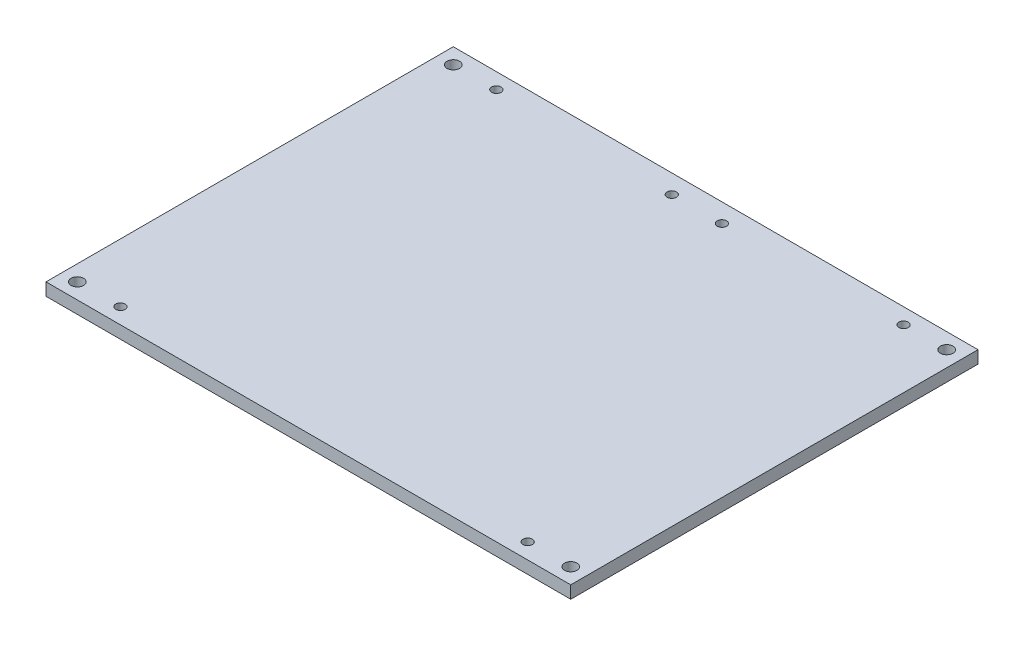
ISO-10303-21;
HEADER;
FILE_DESCRIPTION(('STEP AP214'),'2;1');
FILE_NAME('part.step','',(''),(''),'','','');
FILE_SCHEMA(('AUTOMOTIVE_DESIGN { 1 0 10303 214 1 1 1 1 }'));
ENDSEC;
DATA;
#1=APPLICATION_CONTEXT('core data for automotive mechanical design processes');
#2=APPLICATION_PROTOCOL_DEFINITION('international standard','automotive_design',2000,#1);
#3=PRODUCT_CONTEXT('',#1,'mechanical');
#4=PRODUCT('Part','Part','',(#3));
#5=PRODUCT_RELATED_PRODUCT_CATEGORY('part','',(#4));
#6=PRODUCT_DEFINITION_FORMATION('','',#4);
#7=PRODUCT_DEFINITION_CONTEXT('part definition',#1,'design');
#8=PRODUCT_DEFINITION('design','',#6,#7);
#9=PRODUCT_DEFINITION_SHAPE('','',#8);
#10=(LENGTH_UNIT() NAMED_UNIT(*) SI_UNIT(.MILLI.,.METRE.));
#11=(NAMED_UNIT(*) PLANE_ANGLE_UNIT() SI_UNIT($,.RADIAN.));
#12=(NAMED_UNIT(*) SI_UNIT($,.STERADIAN.) SOLID_ANGLE_UNIT());
#13=UNCERTAINTY_MEASURE_WITH_UNIT(LENGTH_MEASURE(1.E-05),#10,'distance_accuracy_value','');
#14=(GEOMETRIC_REPRESENTATION_CONTEXT(3) GLOBAL_UNCERTAINTY_ASSIGNED_CONTEXT((#13)) GLOBAL_UNIT_ASSIGNED_CONTEXT((#10,
#11,#12)) REPRESENTATION_CONTEXT('',''));
#15=CARTESIAN_POINT('',(0.,0.,0.));
#16=DIRECTION('',(0.,0.,1.));
#17=DIRECTION('',(1.,0.,0.));
#18=AXIS2_PLACEMENT_3D('',#15,#16,#17);
#19=CARTESIAN_POINT('',(83.75,4.,-65.));
#20=DIRECTION('',(-1.,0.,0.));
#21=DIRECTION('',(0.,0.,1.));
#22=AXIS2_PLACEMENT_3D('',#19,#20,#21);
#23=PLANE('',#22);
#24=DIRECTION('',(0.,0.,-1.));
#25=VECTOR('',#24,1.);
#26=CARTESIAN_POINT('',(83.75,0.,-65.));
#27=LINE('',#26,#25);
#28=CARTESIAN_POINT('',(83.75,0.,65.));
#29=VERTEX_POINT('',#28);
#30=CARTESIAN_POINT('',(83.75,0.,-65.));
#31=VERTEX_POINT('',#30);
#32=EDGE_CURVE('E101',#29,#31,#27,.T.);
#33=ORIENTED_EDGE('',*,*,#32,.T.);
#34=DIRECTION('',(0.,-1.,0.));
#35=VECTOR('',#34,1.);
#36=CARTESIAN_POINT('',(83.75,4.,-65.));
#37=LINE('',#36,#35);
#38=CARTESIAN_POINT('',(83.75,4.,-65.));
#39=VERTEX_POINT('',#38);
#40=EDGE_CURVE('E11',#39,#31,#37,.T.);
#41=ORIENTED_EDGE('',*,*,#40,.F.);
#42=DIRECTION('',(0.,0.,-1.));
#43=VECTOR('',#42,1.);
#44=CARTESIAN_POINT('',(83.75,4.,-65.));
#45=LINE('',#44,#43);
#46=CARTESIAN_POINT('',(83.75,4.,65.));
#47=VERTEX_POINT('',#46);
#48=EDGE_CURVE('E88',#47,#39,#45,.T.);
#49=ORIENTED_EDGE('',*,*,#48,.F.);
#50=DIRECTION('',(0.,-1.,0.));
#51=VECTOR('',#50,1.);
#52=CARTESIAN_POINT('',(83.75,4.,65.));
#53=LINE('',#52,#51);
#54=EDGE_CURVE('E97',#47,#29,#53,.T.);
#55=ORIENTED_EDGE('',*,*,#54,.T.);
#56=EDGE_LOOP('',(#33,#41,#49,#55));
#57=FACE_BOUND('',#56,.T.);
#58=ADVANCED_FACE('F35',(#57),#23,.F.);
#59=CARTESIAN_POINT('',(-83.75,4.,-65.));
#60=DIRECTION('',(0.,0.,1.));
#61=DIRECTION('',(1.,0.,0.));
#62=AXIS2_PLACEMENT_3D('',#59,#60,#61);
#63=PLANE('',#62);
#64=DIRECTION('',(-1.,0.,0.));
#65=VECTOR('',#64,1.);
#66=CARTESIAN_POINT('',(-83.75,0.,-65.));
#67=LINE('',#66,#65);
#68=CARTESIAN_POINT('',(-83.75,0.,-65.));
#69=VERTEX_POINT('',#68);
#70=EDGE_CURVE('E92',#31,#69,#67,.T.);
#71=ORIENTED_EDGE('',*,*,#70,.T.);
#72=DIRECTION('',(0.,-1.,0.));
#73=VECTOR('',#72,1.);
#74=CARTESIAN_POINT('',(-83.75,4.,-65.));
#75=LINE('',#74,#73);
#76=CARTESIAN_POINT('',(-83.75,4.,-65.));
#77=VERTEX_POINT('',#76);
#78=EDGE_CURVE('E44',#77,#69,#75,.T.);
#79=ORIENTED_EDGE('',*,*,#78,.F.);
#80=DIRECTION('',(-1.,0.,0.));
#81=VECTOR('',#80,1.);
#82=CARTESIAN_POINT('',(-83.75,4.,-65.));
#83=LINE('',#82,#81);
#84=EDGE_CURVE('E83',#39,#77,#83,.T.);
#85=ORIENTED_EDGE('',*,*,#84,.F.);
#86=ORIENTED_EDGE('',*,*,#40,.T.);
#87=EDGE_LOOP('',(#71,#79,#85,#86));
#88=FACE_BOUND('',#87,.T.);
#89=ADVANCED_FACE('F91',(#88),#63,.F.);
#90=CARTESIAN_POINT('',(-83.75,4.,-65.));
#91=DIRECTION('',(1.,0.,0.));
#92=DIRECTION('',(0.,0.,-1.));
#93=AXIS2_PLACEMENT_3D('',#90,#91,#92);
#94=PLANE('',#93);
#95=DIRECTION('',(0.,0.,1.));
#96=VECTOR('',#95,1.);
#97=CARTESIAN_POINT('',(-83.75,0.,-65.));
#98=LINE('',#97,#96);
#99=CARTESIAN_POINT('',(-83.75,0.,65.));
#100=VERTEX_POINT('',#99);
#101=EDGE_CURVE('E70',#69,#100,#98,.T.);
#102=ORIENTED_EDGE('',*,*,#101,.T.);
#103=DIRECTION('',(0.,-1.,0.));
#104=VECTOR('',#103,1.);
#105=CARTESIAN_POINT('',(-83.75,4.,65.));
#106=LINE('',#105,#104);
#107=CARTESIAN_POINT('',(-83.75,4.,65.));
#108=VERTEX_POINT('',#107);
#109=EDGE_CURVE('E93',#108,#100,#106,.T.);
#110=ORIENTED_EDGE('',*,*,#109,.F.);
#111=DIRECTION('',(0.,0.,1.));
#112=VECTOR('',#111,1.);
#113=CARTESIAN_POINT('',(-83.75,4.,-65.));
#114=LINE('',#113,#112);
#115=EDGE_CURVE('E86',#77,#108,#114,.T.);
#116=ORIENTED_EDGE('',*,*,#115,.F.);
#117=ORIENTED_EDGE('',*,*,#78,.T.);
#118=EDGE_LOOP('',(#102,#110,#116,#117));
#119=FACE_BOUND('',#118,.T.);
#120=ADVANCED_FACE('F95',(#119),#94,.F.);
#121=CARTESIAN_POINT('',(-83.75,4.,65.));
#122=DIRECTION('',(0.,0.,-1.));
#123=DIRECTION('',(-1.,0.,0.));
#124=AXIS2_PLACEMENT_3D('',#121,#122,#123);
#125=PLANE('',#124);
#126=DIRECTION('',(1.,0.,0.));
#127=VECTOR('',#126,1.);
#128=CARTESIAN_POINT('',(-83.75,0.,65.));
#129=LINE('',#128,#127);
#130=EDGE_CURVE('E76',#100,#29,#129,.T.);
#131=ORIENTED_EDGE('',*,*,#130,.T.);
#132=ORIENTED_EDGE('',*,*,#54,.F.);
#133=DIRECTION('',(1.,0.,0.));
#134=VECTOR('',#133,1.);
#135=CARTESIAN_POINT('',(-83.75,4.,65.));
#136=LINE('',#135,#134);
#137=EDGE_CURVE('E53',#108,#47,#136,.T.);
#138=ORIENTED_EDGE('',*,*,#137,.F.);
#139=ORIENTED_EDGE('',*,*,#109,.T.);
#140=EDGE_LOOP('',(#131,#132,#138,#139));
#141=FACE_BOUND('',#140,.T.);
#142=ADVANCED_FACE('F163',(#141),#125,.F.);
#143=CARTESIAN_POINT('',(0.,4.,0.));
#144=DIRECTION('',(0.,1.,0.));
#145=DIRECTION('',(0.,0.,1.));
#146=AXIS2_PLACEMENT_3D('',#143,#144,#145);
#147=PLANE('',#146);
#148=CARTESIAN_POINT('',(-78.75,4.,60.));
#149=DIRECTION('',(0.,1.,0.));
#150=DIRECTION('',(0.,0.,1.));
#151=AXIS2_PLACEMENT_3D('',#148,#149,#150);
#152=CIRCLE('',#151,2.);
#153=CARTESIAN_POINT('',(-78.75,4.,62.));
#154=VERTEX_POINT('',#153);
#155=EDGE_CURVE('E366',#154,#154,#152,.T.);
#156=ORIENTED_EDGE('',*,*,#155,.F.);
#157=EDGE_LOOP('',(#156));
#158=FACE_BOUND('',#157,.T.);
#159=CARTESIAN_POINT('',(78.75,4.,60.));
#160=DIRECTION('',(0.,1.,0.));
#161=DIRECTION('',(0.,0.,1.));
#162=AXIS2_PLACEMENT_3D('',#159,#160,#161);
#163=CIRCLE('',#162,2.);
#164=CARTESIAN_POINT('',(78.75,4.,62.));
#165=VERTEX_POINT('',#164);
#166=EDGE_CURVE('E367',#165,#165,#163,.T.);
#167=ORIENTED_EDGE('',*,*,#166,.F.);
#168=EDGE_LOOP('',(#167));
#169=FACE_BOUND('',#168,.T.);
#170=CARTESIAN_POINT('',(78.75,4.,-60.));
#171=DIRECTION('',(0.,1.,0.));
#172=DIRECTION('',(0.,0.,1.));
#173=AXIS2_PLACEMENT_3D('',#170,#171,#172);
#174=CIRCLE('',#173,2.);
#175=CARTESIAN_POINT('',(78.75,4.,-58.));
#176=VERTEX_POINT('',#175);
#177=EDGE_CURVE('E370',#176,#176,#174,.T.);
#178=ORIENTED_EDGE('',*,*,#177,.F.);
#179=EDGE_LOOP('',(#178));
#180=FACE_BOUND('',#179,.T.);
#181=CARTESIAN_POINT('',(-78.75,4.,-60.));
#182=DIRECTION('',(0.,1.,0.));
#183=DIRECTION('',(0.,0.,1.));
#184=AXIS2_PLACEMENT_3D('',#181,#182,#183);
#185=CIRCLE('',#184,2.);
#186=CARTESIAN_POINT('',(-78.75,4.,-58.));
#187=VERTEX_POINT('',#186);
#188=EDGE_CURVE('E114',#187,#187,#185,.T.);
#189=ORIENTED_EDGE('',*,*,#188,.F.);
#190=EDGE_LOOP('',(#189));
#191=FACE_BOUND('',#190,.T.);
#192=CARTESIAN_POINT('',(-8.,4.,-59.));
#193=DIRECTION('',(0.,1.,0.));
#194=DIRECTION('',(0.,0.,1.));
#195=AXIS2_PLACEMENT_3D('',#192,#193,#194);
#196=CIRCLE('',#195,1.5);
#197=CARTESIAN_POINT('',(-8.,4.,-57.5));
#198=VERTEX_POINT('',#197);
#199=EDGE_CURVE('E130',#198,#198,#196,.T.);
#200=ORIENTED_EDGE('',*,*,#199,.F.);
#201=EDGE_LOOP('',(#200));
#202=FACE_BOUND('',#201,.T.);
#203=CARTESIAN_POINT('',(8.,4.,-59.));
#204=DIRECTION('',(0.,1.,0.));
#205=DIRECTION('',(0.,0.,1.));
#206=AXIS2_PLACEMENT_3D('',#203,#204,#205);
#207=CIRCLE('',#206,1.5);
#208=CARTESIAN_POINT('',(8.,4.,-57.5));
#209=VERTEX_POINT('',#208);
#210=EDGE_CURVE('E121',#209,#209,#207,.T.);
#211=ORIENTED_EDGE('',*,*,#210,.F.);
#212=EDGE_LOOP('',(#211));
#213=FACE_BOUND('',#212,.T.);
#214=CARTESIAN_POINT('',(-65.,4.,-60.));
#215=DIRECTION('',(0.,1.,0.));
#216=DIRECTION('',(0.,0.,1.));
#217=AXIS2_PLACEMENT_3D('',#214,#215,#216);
#218=CIRCLE('',#217,1.5);
#219=CARTESIAN_POINT('',(-65.,4.,-58.5));
#220=VERTEX_POINT('',#219);
#221=EDGE_CURVE('E150',#220,#220,#218,.T.);
#222=ORIENTED_EDGE('',*,*,#221,.F.);
#223=EDGE_LOOP('',(#222));
#224=FACE_BOUND('',#223,.T.);
#225=CARTESIAN_POINT('',(65.,4.,-60.));
#226=DIRECTION('',(0.,1.,0.));
#227=DIRECTION('',(0.,0.,1.));
#228=AXIS2_PLACEMENT_3D('',#225,#226,#227);
#229=CIRCLE('',#228,1.5);
#230=CARTESIAN_POINT('',(65.,4.,-58.5));
#231=VERTEX_POINT('',#230);
#232=EDGE_CURVE('E144',#231,#231,#229,.T.);
#233=ORIENTED_EDGE('',*,*,#232,.F.);
#234=EDGE_LOOP('',(#233));
#235=FACE_BOUND('',#234,.T.);
#236=CARTESIAN_POINT('',(65.,4.,60.));
#237=DIRECTION('',(0.,1.,0.));
#238=DIRECTION('',(0.,0.,1.));
#239=AXIS2_PLACEMENT_3D('',#236,#237,#238);
#240=CIRCLE('',#239,1.5);
#241=CARTESIAN_POINT('',(65.,4.,61.5));
#242=VERTEX_POINT('',#241);
#243=EDGE_CURVE('E138',#242,#242,#240,.T.);
#244=ORIENTED_EDGE('',*,*,#243,.F.);
#245=EDGE_LOOP('',(#244));
#246=FACE_BOUND('',#245,.T.);
#247=CARTESIAN_POINT('',(-65.,4.,60.));
#248=DIRECTION('',(0.,1.,0.));
#249=DIRECTION('',(0.,0.,1.));
#250=AXIS2_PLACEMENT_3D('',#247,#248,#249);
#251=CIRCLE('',#250,1.5);
#252=CARTESIAN_POINT('',(-65.,4.,61.5));
#253=VERTEX_POINT('',#252);
#254=EDGE_CURVE('E137',#253,#253,#251,.T.);
#255=ORIENTED_EDGE('',*,*,#254,.F.);
#256=EDGE_LOOP('',(#255));
#257=FACE_BOUND('',#256,.T.);
#258=ORIENTED_EDGE('',*,*,#48,.T.);
#259=ORIENTED_EDGE('',*,*,#84,.T.);
#260=ORIENTED_EDGE('',*,*,#115,.T.);
#261=ORIENTED_EDGE('',*,*,#137,.T.);
#262=EDGE_LOOP('',(#258,#259,#260,#261));
#263=FACE_BOUND('',#262,.T.);
#264=ADVANCED_FACE('F84',(#158,#169,#180,#191,#202,#213,#224,#235,#246,#257,#263),#147,.T.);
#265=CARTESIAN_POINT('',(0.,0.,0.));
#266=DIRECTION('',(0.,1.,0.));
#267=DIRECTION('',(0.,0.,1.));
#268=AXIS2_PLACEMENT_3D('',#265,#266,#267);
#269=PLANE('',#268);
#270=CARTESIAN_POINT('',(-78.75,0.,60.));
#271=DIRECTION('',(0.,1.,0.));
#272=DIRECTION('',(0.,0.,1.));
#273=AXIS2_PLACEMENT_3D('',#270,#271,#272);
#274=CIRCLE('',#273,2.);
#275=CARTESIAN_POINT('',(-78.75,0.,62.));
#276=VERTEX_POINT('',#275);
#277=EDGE_CURVE('E38',#276,#276,#274,.T.);
#278=ORIENTED_EDGE('',*,*,#277,.T.);
#279=EDGE_LOOP('',(#278));
#280=FACE_BOUND('',#279,.T.);
#281=CARTESIAN_POINT('',(78.75,0.,60.));
#282=DIRECTION('',(0.,1.,0.));
#283=DIRECTION('',(0.,0.,1.));
#284=AXIS2_PLACEMENT_3D('',#281,#282,#283);
#285=CIRCLE('',#284,2.);
#286=CARTESIAN_POINT('',(78.75,0.,62.));
#287=VERTEX_POINT('',#286);
#288=EDGE_CURVE('E116',#287,#287,#285,.T.);
#289=ORIENTED_EDGE('',*,*,#288,.T.);
#290=EDGE_LOOP('',(#289));
#291=FACE_BOUND('',#290,.T.);
#292=CARTESIAN_POINT('',(78.75,0.,-60.));
#293=DIRECTION('',(0.,1.,0.));
#294=DIRECTION('',(0.,0.,1.));
#295=AXIS2_PLACEMENT_3D('',#292,#293,#294);
#296=CIRCLE('',#295,2.);
#297=CARTESIAN_POINT('',(78.75,0.,-58.));
#298=VERTEX_POINT('',#297);
#299=EDGE_CURVE('E113',#298,#298,#296,.T.);
#300=ORIENTED_EDGE('',*,*,#299,.T.);
#301=EDGE_LOOP('',(#300));
#302=FACE_BOUND('',#301,.T.);
#303=CARTESIAN_POINT('',(-78.75,0.,-60.));
#304=DIRECTION('',(0.,1.,0.));
#305=DIRECTION('',(0.,0.,1.));
#306=AXIS2_PLACEMENT_3D('',#303,#304,#305);
#307=CIRCLE('',#306,2.);
#308=CARTESIAN_POINT('',(-78.75,0.,-58.));
#309=VERTEX_POINT('',#308);
#310=EDGE_CURVE('E110',#309,#309,#307,.T.);
#311=ORIENTED_EDGE('',*,*,#310,.T.);
#312=EDGE_LOOP('',(#311));
#313=FACE_BOUND('',#312,.T.);
#314=ORIENTED_EDGE('',*,*,#32,.F.);
#315=ORIENTED_EDGE('',*,*,#130,.F.);
#316=ORIENTED_EDGE('',*,*,#101,.F.);
#317=ORIENTED_EDGE('',*,*,#70,.F.);
#318=EDGE_LOOP('',(#314,#315,#316,#317));
#319=FACE_BOUND('',#318,.T.);
#320=ADVANCED_FACE('F162',(#280,#291,#302,#313,#319),#269,.F.);
#321=CARTESIAN_POINT('',(-65.,1.,60.));
#322=DIRECTION('',(0.,1.,0.));
#323=DIRECTION('',(0.,0.,1.));
#324=AXIS2_PLACEMENT_3D('',#321,#322,#323);
#325=CYLINDRICAL_SURFACE('',#324,1.5);
#326=CARTESIAN_POINT('',(-65.,1.,60.));
#327=DIRECTION('',(0.,1.,0.));
#328=DIRECTION('',(0.,0.,1.));
#329=AXIS2_PLACEMENT_3D('',#326,#327,#328);
#330=CIRCLE('',#329,1.5);
#331=CARTESIAN_POINT('',(-65.,1.,61.5));
#332=VERTEX_POINT('',#331);
#333=EDGE_CURVE('E104',#332,#332,#330,.T.);
#334=ORIENTED_EDGE('',*,*,#333,.F.);
#335=EDGE_LOOP('',(#334));
#336=FACE_BOUND('',#335,.T.);
#337=ORIENTED_EDGE('',*,*,#254,.T.);
#338=EDGE_LOOP('',(#337));
#339=FACE_BOUND('',#338,.T.);
#340=ADVANCED_FACE('F159',(#336,#339),#325,.F.);
#341=CARTESIAN_POINT('',(-65.,1.,60.));
#342=DIRECTION('',(0.,1.,0.));
#343=DIRECTION('',(0.,0.,1.));
#344=AXIS2_PLACEMENT_3D('',#341,#342,#343);
#345=PLANE('',#344);
#346=ORIENTED_EDGE('',*,*,#333,.T.);
#347=EDGE_LOOP('',(#346));
#348=FACE_BOUND('',#347,.T.);
#349=ADVANCED_FACE('F202',(#348),#345,.T.);
#350=CARTESIAN_POINT('',(65.,1.,60.));
#351=DIRECTION('',(0.,1.,0.));
#352=DIRECTION('',(0.,0.,1.));
#353=AXIS2_PLACEMENT_3D('',#350,#351,#352);
#354=CYLINDRICAL_SURFACE('',#353,1.5);
#355=CARTESIAN_POINT('',(65.,1.,60.));
#356=DIRECTION('',(0.,1.,0.));
#357=DIRECTION('',(0.,0.,1.));
#358=AXIS2_PLACEMENT_3D('',#355,#356,#357);
#359=CIRCLE('',#358,1.5);
#360=CARTESIAN_POINT('',(65.,1.,61.5));
#361=VERTEX_POINT('',#360);
#362=EDGE_CURVE('E134',#361,#361,#359,.T.);
#363=ORIENTED_EDGE('',*,*,#362,.F.);
#364=EDGE_LOOP('',(#363));
#365=FACE_BOUND('',#364,.T.);
#366=ORIENTED_EDGE('',*,*,#243,.T.);
#367=EDGE_LOOP('',(#366));
#368=FACE_BOUND('',#367,.T.);
#369=ADVANCED_FACE('F212',(#365,#368),#354,.F.);
#370=CARTESIAN_POINT('',(65.,1.,60.));
#371=DIRECTION('',(0.,1.,0.));
#372=DIRECTION('',(0.,0.,1.));
#373=AXIS2_PLACEMENT_3D('',#370,#371,#372);
#374=PLANE('',#373);
#375=ORIENTED_EDGE('',*,*,#362,.T.);
#376=EDGE_LOOP('',(#375));
#377=FACE_BOUND('',#376,.T.);
#378=ADVANCED_FACE('F222',(#377),#374,.T.);
#379=CARTESIAN_POINT('',(65.,1.,-60.));
#380=DIRECTION('',(0.,1.,0.));
#381=DIRECTION('',(0.,0.,1.));
#382=AXIS2_PLACEMENT_3D('',#379,#380,#381);
#383=CYLINDRICAL_SURFACE('',#382,1.5);
#384=CARTESIAN_POINT('',(65.,1.,-60.));
#385=DIRECTION('',(0.,1.,0.));
#386=DIRECTION('',(0.,0.,1.));
#387=AXIS2_PLACEMENT_3D('',#384,#385,#386);
#388=CIRCLE('',#387,1.5);
#389=CARTESIAN_POINT('',(65.,1.,-58.5));
#390=VERTEX_POINT('',#389);
#391=EDGE_CURVE('E141',#390,#390,#388,.T.);
#392=ORIENTED_EDGE('',*,*,#391,.F.);
#393=EDGE_LOOP('',(#392));
#394=FACE_BOUND('',#393,.T.);
#395=ORIENTED_EDGE('',*,*,#232,.T.);
#396=EDGE_LOOP('',(#395));
#397=FACE_BOUND('',#396,.T.);
#398=ADVANCED_FACE('F232',(#394,#397),#383,.F.);
#399=CARTESIAN_POINT('',(65.,1.,-60.));
#400=DIRECTION('',(0.,1.,0.));
#401=DIRECTION('',(0.,0.,1.));
#402=AXIS2_PLACEMENT_3D('',#399,#400,#401);
#403=PLANE('',#402);
#404=ORIENTED_EDGE('',*,*,#391,.T.);
#405=EDGE_LOOP('',(#404));
#406=FACE_BOUND('',#405,.T.);
#407=ADVANCED_FACE('F242',(#406),#403,.T.);
#408=CARTESIAN_POINT('',(-65.,1.,-60.));
#409=DIRECTION('',(0.,1.,0.));
#410=DIRECTION('',(0.,0.,1.));
#411=AXIS2_PLACEMENT_3D('',#408,#409,#410);
#412=CYLINDRICAL_SURFACE('',#411,1.5);
#413=CARTESIAN_POINT('',(-65.,1.,-60.));
#414=DIRECTION('',(0.,1.,0.));
#415=DIRECTION('',(0.,0.,1.));
#416=AXIS2_PLACEMENT_3D('',#413,#414,#415);
#417=CIRCLE('',#416,1.5);
#418=CARTESIAN_POINT('',(-65.,1.,-58.5));
#419=VERTEX_POINT('',#418);
#420=EDGE_CURVE('E147',#419,#419,#417,.T.);
#421=ORIENTED_EDGE('',*,*,#420,.F.);
#422=EDGE_LOOP('',(#421));
#423=FACE_BOUND('',#422,.T.);
#424=ORIENTED_EDGE('',*,*,#221,.T.);
#425=EDGE_LOOP('',(#424));
#426=FACE_BOUND('',#425,.T.);
#427=ADVANCED_FACE('F252',(#423,#426),#412,.F.);
#428=CARTESIAN_POINT('',(-65.,1.,-60.));
#429=DIRECTION('',(0.,1.,0.));
#430=DIRECTION('',(0.,0.,1.));
#431=AXIS2_PLACEMENT_3D('',#428,#429,#430);
#432=PLANE('',#431);
#433=ORIENTED_EDGE('',*,*,#420,.T.);
#434=EDGE_LOOP('',(#433));
#435=FACE_BOUND('',#434,.T.);
#436=ADVANCED_FACE('F262',(#435),#432,.T.);
#437=CARTESIAN_POINT('',(8.,1.,-59.));
#438=DIRECTION('',(0.,1.,0.));
#439=DIRECTION('',(0.,0.,1.));
#440=AXIS2_PLACEMENT_3D('',#437,#438,#439);
#441=CYLINDRICAL_SURFACE('',#440,1.5);
#442=CARTESIAN_POINT('',(8.,1.,-59.));
#443=DIRECTION('',(0.,1.,0.));
#444=DIRECTION('',(0.,0.,1.));
#445=AXIS2_PLACEMENT_3D('',#442,#443,#444);
#446=CIRCLE('',#445,1.5);
#447=CARTESIAN_POINT('',(8.,1.,-57.5));
#448=VERTEX_POINT('',#447);
#449=EDGE_CURVE('E125',#448,#448,#446,.T.);
#450=ORIENTED_EDGE('',*,*,#449,.F.);
#451=EDGE_LOOP('',(#450));
#452=FACE_BOUND('',#451,.T.);
#453=ORIENTED_EDGE('',*,*,#210,.T.);
#454=EDGE_LOOP('',(#453));
#455=FACE_BOUND('',#454,.T.);
#456=ADVANCED_FACE('F272',(#452,#455),#441,.F.);
#457=CARTESIAN_POINT('',(8.,1.,-59.));
#458=DIRECTION('',(0.,1.,0.));
#459=DIRECTION('',(0.,0.,1.));
#460=AXIS2_PLACEMENT_3D('',#457,#458,#459);
#461=PLANE('',#460);
#462=ORIENTED_EDGE('',*,*,#449,.T.);
#463=EDGE_LOOP('',(#462));
#464=FACE_BOUND('',#463,.T.);
#465=ADVANCED_FACE('F282',(#464),#461,.T.);
#466=CARTESIAN_POINT('',(-8.,1.,-59.));
#467=DIRECTION('',(0.,1.,0.));
#468=DIRECTION('',(0.,0.,1.));
#469=AXIS2_PLACEMENT_3D('',#466,#467,#468);
#470=CYLINDRICAL_SURFACE('',#469,1.5);
#471=CARTESIAN_POINT('',(-8.,1.,-59.));
#472=DIRECTION('',(0.,1.,0.));
#473=DIRECTION('',(0.,0.,1.));
#474=AXIS2_PLACEMENT_3D('',#471,#472,#473);
#475=CIRCLE('',#474,1.5);
#476=CARTESIAN_POINT('',(-8.,1.,-57.5));
#477=VERTEX_POINT('',#476);
#478=EDGE_CURVE('E153',#477,#477,#475,.T.);
#479=ORIENTED_EDGE('',*,*,#478,.F.);
#480=EDGE_LOOP('',(#479));
#481=FACE_BOUND('',#480,.T.);
#482=ORIENTED_EDGE('',*,*,#199,.T.);
#483=EDGE_LOOP('',(#482));
#484=FACE_BOUND('',#483,.T.);
#485=ADVANCED_FACE('F292',(#481,#484),#470,.F.);
#486=CARTESIAN_POINT('',(-8.,1.,-59.));
#487=DIRECTION('',(0.,1.,0.));
#488=DIRECTION('',(0.,0.,1.));
#489=AXIS2_PLACEMENT_3D('',#486,#487,#488);
#490=PLANE('',#489);
#491=ORIENTED_EDGE('',*,*,#478,.T.);
#492=EDGE_LOOP('',(#491));
#493=FACE_BOUND('',#492,.T.);
#494=ADVANCED_FACE('F302',(#493),#490,.T.);
#495=CARTESIAN_POINT('',(-78.75,-6.,-60.));
#496=DIRECTION('',(0.,1.,0.));
#497=DIRECTION('',(0.,0.,1.));
#498=AXIS2_PLACEMENT_3D('',#495,#496,#497);
#499=CYLINDRICAL_SURFACE('',#498,2.);
#500=ORIENTED_EDGE('',*,*,#188,.T.);
#501=EDGE_LOOP('',(#500));
#502=FACE_BOUND('',#501,.T.);
#503=ORIENTED_EDGE('',*,*,#310,.F.);
#504=EDGE_LOOP('',(#503));
#505=FACE_BOUND('',#504,.T.);
#506=ADVANCED_FACE('F311',(#502,#505),#499,.F.);
#507=CARTESIAN_POINT('',(78.75,-6.,-60.));
#508=DIRECTION('',(0.,1.,0.));
#509=DIRECTION('',(0.,0.,1.));
#510=AXIS2_PLACEMENT_3D('',#507,#508,#509);
#511=CYLINDRICAL_SURFACE('',#510,2.);
#512=ORIENTED_EDGE('',*,*,#177,.T.);
#513=EDGE_LOOP('',(#512));
#514=FACE_BOUND('',#513,.T.);
#515=ORIENTED_EDGE('',*,*,#299,.F.);
#516=EDGE_LOOP('',(#515));
#517=FACE_BOUND('',#516,.T.);
#518=ADVANCED_FACE('F330',(#514,#517),#511,.F.);
#519=CARTESIAN_POINT('',(78.75,-6.,60.));
#520=DIRECTION('',(0.,1.,0.));
#521=DIRECTION('',(0.,0.,1.));
#522=AXIS2_PLACEMENT_3D('',#519,#520,#521);
#523=CYLINDRICAL_SURFACE('',#522,2.);
#524=ORIENTED_EDGE('',*,*,#166,.T.);
#525=EDGE_LOOP('',(#524));
#526=FACE_BOUND('',#525,.T.);
#527=ORIENTED_EDGE('',*,*,#288,.F.);
#528=EDGE_LOOP('',(#527));
#529=FACE_BOUND('',#528,.T.);
#530=ADVANCED_FACE('F340',(#526,#529),#523,.F.);
#531=CARTESIAN_POINT('',(-78.75,-6.,60.));
#532=DIRECTION('',(0.,1.,0.));
#533=DIRECTION('',(0.,0.,1.));
#534=AXIS2_PLACEMENT_3D('',#531,#532,#533);
#535=CYLINDRICAL_SURFACE('',#534,2.);
#536=ORIENTED_EDGE('',*,*,#155,.T.);
#537=EDGE_LOOP('',(#536));
#538=FACE_BOUND('',#537,.T.);
#539=ORIENTED_EDGE('',*,*,#277,.F.);
#540=EDGE_LOOP('',(#539));
#541=FACE_BOUND('',#540,.T.);
#542=ADVANCED_FACE('F350',(#538,#541),#535,.F.);
#543=CLOSED_SHELL('',(#58,#89,#120,#142,#264,#320,#340,#349,#369,#378,#398,#407,#427,#436,#456,
#465,#485,#494,#506,#518,#530,#542));
#544=MANIFOLD_SOLID_BREP('B2',#543);
#545=ADVANCED_BREP_SHAPE_REPRESENTATION('',(#18,#544),#14);
#546=SHAPE_DEFINITION_REPRESENTATION(#9,#545);
ENDSEC;
END-ISO-10303-21;
